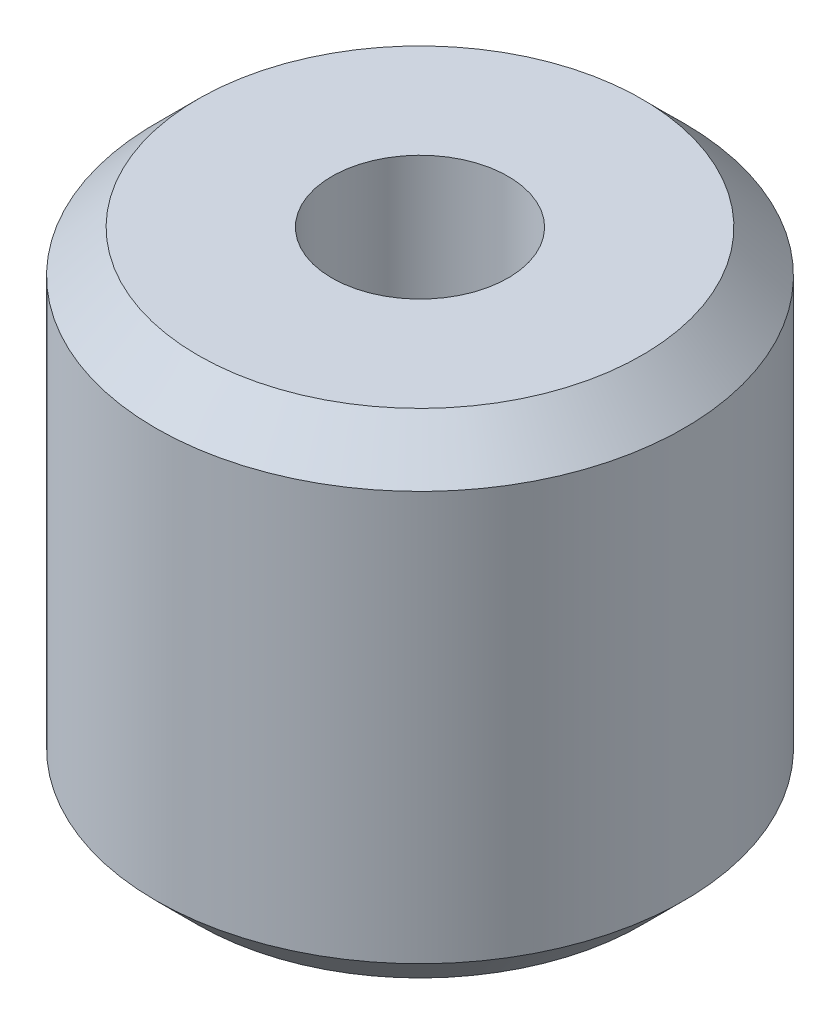
ISO-10303-21;
HEADER;
FILE_DESCRIPTION(('STEP AP214'),'2;1');
FILE_NAME('part.step','',(''),(''),'','','');
FILE_SCHEMA(('AUTOMOTIVE_DESIGN { 1 0 10303 214 1 1 1 1 }'));
ENDSEC;
DATA;
#1=APPLICATION_CONTEXT('core data for automotive mechanical design processes');
#2=APPLICATION_PROTOCOL_DEFINITION('international standard','automotive_design',2000,#1);
#3=PRODUCT_CONTEXT('',#1,'mechanical');
#4=PRODUCT('Part','Part','',(#3));
#5=PRODUCT_RELATED_PRODUCT_CATEGORY('part','',(#4));
#6=PRODUCT_DEFINITION_FORMATION('','',#4);
#7=PRODUCT_DEFINITION_CONTEXT('part definition',#1,'design');
#8=PRODUCT_DEFINITION('design','',#6,#7);
#9=PRODUCT_DEFINITION_SHAPE('','',#8);
#10=(LENGTH_UNIT() NAMED_UNIT(*) SI_UNIT(.MILLI.,.METRE.));
#11=(NAMED_UNIT(*) PLANE_ANGLE_UNIT() SI_UNIT($,.RADIAN.));
#12=(NAMED_UNIT(*) SI_UNIT($,.STERADIAN.) SOLID_ANGLE_UNIT());
#13=UNCERTAINTY_MEASURE_WITH_UNIT(LENGTH_MEASURE(1.E-05),#10,'distance_accuracy_value','');
#14=(GEOMETRIC_REPRESENTATION_CONTEXT(3) GLOBAL_UNCERTAINTY_ASSIGNED_CONTEXT((#13)) GLOBAL_UNIT_ASSIGNED_CONTEXT((#10,
#11,#12)) REPRESENTATION_CONTEXT('',''));
#15=CARTESIAN_POINT('',(0.,0.,0.));
#16=DIRECTION('',(0.,0.,1.));
#17=DIRECTION('',(1.,0.,0.));
#18=AXIS2_PLACEMENT_3D('',#15,#16,#17);
#19=CARTESIAN_POINT('',(0.,8.9,0.));
#20=DIRECTION('',(0.,1.,0.));
#21=DIRECTION('',(0.,0.,1.));
#22=AXIS2_PLACEMENT_3D('',#19,#20,#21);
#23=PLANE('',#22);
#24=CARTESIAN_POINT('',(0.,8.9,0.));
#25=DIRECTION('',(0.,1.,0.));
#26=DIRECTION('',(0.,0.,1.));
#27=AXIS2_PLACEMENT_3D('',#24,#25,#26);
#28=CIRCLE('',#27,4.005);
#29=CARTESIAN_POINT('',(0.,8.9,4.005));
#30=VERTEX_POINT('',#29);
#31=EDGE_CURVE('E58',#30,#30,#28,.T.);
#32=ORIENTED_EDGE('',*,*,#31,.T.);
#33=EDGE_LOOP('',(#32));
#34=FACE_BOUND('',#33,.T.);
#35=CARTESIAN_POINT('',(0.,8.9,0.));
#36=DIRECTION('',(0.,1.,0.));
#37=DIRECTION('',(0.,0.,1.));
#38=AXIS2_PLACEMENT_3D('',#35,#36,#37);
#39=CIRCLE('',#38,1.59);
#40=CARTESIAN_POINT('',(0.,8.9,1.59));
#41=VERTEX_POINT('',#40);
#42=EDGE_CURVE('E64',#41,#41,#39,.T.);
#43=ORIENTED_EDGE('',*,*,#42,.F.);
#44=EDGE_LOOP('',(#43));
#45=FACE_BOUND('',#44,.T.);
#46=ADVANCED_FACE('F39',(#34,#45),#23,.T.);
#47=CARTESIAN_POINT('',(0.,0.,0.));
#48=DIRECTION('',(0.,1.,0.));
#49=DIRECTION('',(0.,0.,1.));
#50=AXIS2_PLACEMENT_3D('',#47,#48,#49);
#51=PLANE('',#50);
#52=CARTESIAN_POINT('',(0.,0.,0.));
#53=DIRECTION('',(0.,1.,0.));
#54=DIRECTION('',(0.,0.,1.));
#55=AXIS2_PLACEMENT_3D('',#52,#53,#54);
#56=CIRCLE('',#55,4.005);
#57=CARTESIAN_POINT('',(0.,0.,4.005));
#58=VERTEX_POINT('',#57);
#59=EDGE_CURVE('E10',#58,#58,#56,.F.);
#60=ORIENTED_EDGE('',*,*,#59,.T.);
#61=EDGE_LOOP('',(#60));
#62=FACE_BOUND('',#61,.T.);
#63=CARTESIAN_POINT('',(0.,0.,0.));
#64=DIRECTION('',(0.,1.,0.));
#65=DIRECTION('',(0.,0.,1.));
#66=AXIS2_PLACEMENT_3D('',#63,#64,#65);
#67=CIRCLE('',#66,1.59);
#68=CARTESIAN_POINT('',(0.,0.,1.59));
#69=VERTEX_POINT('',#68);
#70=EDGE_CURVE('E65',#69,#69,#67,.T.);
#71=ORIENTED_EDGE('',*,*,#70,.T.);
#72=EDGE_LOOP('',(#71));
#73=FACE_BOUND('',#72,.T.);
#74=ADVANCED_FACE('F77',(#62,#73),#51,.F.);
#75=CARTESIAN_POINT('',(0.,8.9,0.));
#76=DIRECTION('',(0.,-1.,0.));
#77=DIRECTION('',(0.,0.,-1.));
#78=AXIS2_PLACEMENT_3D('',#75,#76,#77);
#79=CYLINDRICAL_SURFACE('',#78,4.765);
#80=CARTESIAN_POINT('',(0.,0.760000000000002,0.));
#81=DIRECTION('',(0.,1.,0.));
#82=DIRECTION('',(0.,0.,1.));
#83=AXIS2_PLACEMENT_3D('',#80,#81,#82);
#84=CIRCLE('',#83,4.765);
#85=CARTESIAN_POINT('',(0.,0.760000000000002,4.765));
#86=VERTEX_POINT('',#85);
#87=EDGE_CURVE('E48',#86,#86,#84,.T.);
#88=ORIENTED_EDGE('',*,*,#87,.T.);
#89=EDGE_LOOP('',(#88));
#90=FACE_BOUND('',#89,.T.);
#91=CARTESIAN_POINT('',(0.,8.14,0.));
#92=DIRECTION('',(0.,1.,0.));
#93=DIRECTION('',(0.,0.,1.));
#94=AXIS2_PLACEMENT_3D('',#91,#92,#93);
#95=CIRCLE('',#94,4.765);
#96=CARTESIAN_POINT('',(0.,8.14,4.765));
#97=VERTEX_POINT('',#96);
#98=EDGE_CURVE('E53',#97,#97,#95,.F.);
#99=ORIENTED_EDGE('',*,*,#98,.T.);
#100=EDGE_LOOP('',(#99));
#101=FACE_BOUND('',#100,.T.);
#102=ADVANCED_FACE('F83',(#90,#101),#79,.T.);
#103=CARTESIAN_POINT('',(0.,8.9,0.));
#104=DIRECTION('',(0.,-1.,0.));
#105=DIRECTION('',(0.,0.,-1.));
#106=AXIS2_PLACEMENT_3D('',#103,#104,#105);
#107=CYLINDRICAL_SURFACE('',#106,1.59);
#108=ORIENTED_EDGE('',*,*,#42,.T.);
#109=EDGE_LOOP('',(#108));
#110=FACE_BOUND('',#109,.T.);
#111=ORIENTED_EDGE('',*,*,#70,.F.);
#112=EDGE_LOOP('',(#111));
#113=FACE_BOUND('',#112,.T.);
#114=ADVANCED_FACE('F73',(#110,#113),#107,.F.);
#115=CARTESIAN_POINT('',(0.,8.9,0.));
#116=DIRECTION('',(0.,-1.,0.));
#117=DIRECTION('',(0.,0.,-1.));
#118=AXIS2_PLACEMENT_3D('',#115,#116,#117);
#119=CONICAL_SURFACE('',#118,4.005,0.785398163397447);
#120=ORIENTED_EDGE('',*,*,#98,.F.);
#121=EDGE_LOOP('',(#120));
#122=FACE_BOUND('',#121,.T.);
#123=ORIENTED_EDGE('',*,*,#31,.F.);
#124=EDGE_LOOP('',(#123));
#125=FACE_BOUND('',#124,.T.);
#126=ADVANCED_FACE('F89',(#122,#125),#119,.T.);
#127=CARTESIAN_POINT('',(0.,0.760000000000002,0.));
#128=DIRECTION('',(0.,1.,0.));
#129=DIRECTION('',(0.,0.,1.));
#130=AXIS2_PLACEMENT_3D('',#127,#128,#129);
#131=CONICAL_SURFACE('',#130,4.765,0.78539816339745);
#132=CARTESIAN_POINT('',(0.,0.,4.005));
#133=CARTESIAN_POINT('',(0.,0.00791666666666678,4.01291666666666));
#134=CARTESIAN_POINT('',(0.,0.0158333333333334,4.02083333333333));
#135=CARTESIAN_POINT('',(0.,0.0316666666666667,4.03666666666666));
#136=CARTESIAN_POINT('',(0.,0.0395833333333333,4.04458333333333));
#137=CARTESIAN_POINT('',(0.,0.0554166666666667,4.06041666666666));
#138=CARTESIAN_POINT('',(0.,0.0633333333333334,4.06833333333333));
#139=CARTESIAN_POINT('',(0.,0.0791666666666668,4.08416666666666));
#140=CARTESIAN_POINT('',(0.,0.0870833333333334,4.09208333333333));
#141=CARTESIAN_POINT('',(0.,0.102916666666667,4.10791666666666));
#142=CARTESIAN_POINT('',(0.,0.110833333333334,4.11583333333333));
#143=CARTESIAN_POINT('',(0.,0.126666666666667,4.13166666666666));
#144=CARTESIAN_POINT('',(0.,0.134583333333334,4.13958333333333));
#145=CARTESIAN_POINT('',(0.,0.150416666666667,4.15541666666666));
#146=CARTESIAN_POINT('',(0.,0.158333333333334,4.16333333333333));
#147=CARTESIAN_POINT('',(0.,0.174166666666667,4.17916666666666));
#148=CARTESIAN_POINT('',(0.,0.182083333333334,4.18708333333333));
#149=CARTESIAN_POINT('',(0.,0.197916666666667,4.20291666666666));
#150=CARTESIAN_POINT('',(0.,0.205833333333334,4.21083333333333));
#151=CARTESIAN_POINT('',(0.,0.221666666666667,4.22666666666666));
#152=CARTESIAN_POINT('',(0.,0.229583333333334,4.23458333333333));
#153=CARTESIAN_POINT('',(0.,0.245416666666667,4.25041666666666));
#154=CARTESIAN_POINT('',(0.,0.253333333333334,4.25833333333333));
#155=CARTESIAN_POINT('',(0.,0.269166666666667,4.27416666666666));
#156=CARTESIAN_POINT('',(0.,0.277083333333334,4.28208333333333));
#157=CARTESIAN_POINT('',(0.,0.292916666666667,4.29791666666666));
#158=CARTESIAN_POINT('',(0.,0.300833333333334,4.30583333333333));
#159=CARTESIAN_POINT('',(0.,0.316666666666667,4.32166666666666));
#160=CARTESIAN_POINT('',(0.,0.324583333333334,4.32958333333333));
#161=CARTESIAN_POINT('',(0.,0.340416666666667,4.34541666666666));
#162=CARTESIAN_POINT('',(0.,0.348333333333334,4.35333333333333));
#163=CARTESIAN_POINT('',(0.,0.364166666666668,4.36916666666666));
#164=CARTESIAN_POINT('',(0.,0.372083333333334,4.37708333333333));
#165=CARTESIAN_POINT('',(0.,0.387916666666668,4.39291666666666));
#166=CARTESIAN_POINT('',(0.,0.395833333333334,4.40083333333333));
#167=CARTESIAN_POINT('',(0.,0.411666666666668,4.41666666666666));
#168=CARTESIAN_POINT('',(0.,0.419583333333334,4.42458333333333));
#169=CARTESIAN_POINT('',(0.,0.435416666666668,4.44041666666666));
#170=CARTESIAN_POINT('',(0.,0.443333333333334,4.44833333333333));
#171=CARTESIAN_POINT('',(0.,0.459166666666668,4.46416666666666));
#172=CARTESIAN_POINT('',(0.,0.467083333333334,4.47208333333333));
#173=CARTESIAN_POINT('',(0.,0.482916666666668,4.48791666666666));
#174=CARTESIAN_POINT('',(0.,0.490833333333335,4.49583333333333));
#175=CARTESIAN_POINT('',(0.,0.506666666666668,4.51166666666666));
#176=CARTESIAN_POINT('',(0.,0.514583333333335,4.51958333333333));
#177=CARTESIAN_POINT('',(0.,0.530416666666668,4.53541666666666));
#178=CARTESIAN_POINT('',(0.,0.538333333333335,4.54333333333333));
#179=CARTESIAN_POINT('',(0.,0.554166666666668,4.55916666666666));
#180=CARTESIAN_POINT('',(0.,0.562083333333335,4.56708333333333));
#181=CARTESIAN_POINT('',(0.,0.577916666666668,4.58291666666666));
#182=CARTESIAN_POINT('',(0.,0.585833333333335,4.59083333333333));
#183=CARTESIAN_POINT('',(0.,0.601666666666668,4.60666666666667));
#184=CARTESIAN_POINT('',(0.,0.609583333333335,4.61458333333333));
#185=CARTESIAN_POINT('',(0.,0.625416666666668,4.63041666666666));
#186=CARTESIAN_POINT('',(0.,0.633333333333335,4.63833333333333));
#187=CARTESIAN_POINT('',(0.,0.649166666666668,4.65416666666667));
#188=CARTESIAN_POINT('',(0.,0.657083333333335,4.66208333333333));
#189=CARTESIAN_POINT('',(0.,0.672916666666668,4.67791666666667));
#190=CARTESIAN_POINT('',(0.,0.680833333333335,4.68583333333333));
#191=CARTESIAN_POINT('',(0.,0.696666666666668,4.70166666666667));
#192=CARTESIAN_POINT('',(0.,0.704583333333335,4.70958333333333));
#193=CARTESIAN_POINT('',(0.,0.720416666666669,4.72541666666667));
#194=CARTESIAN_POINT('',(0.,0.728333333333335,4.73333333333333));
#195=CARTESIAN_POINT('',(0.,0.744166666666668,4.74916666666667));
#196=CARTESIAN_POINT('',(0.,0.752083333333335,4.75708333333333));
#197=CARTESIAN_POINT('',(0.,0.760000000000002,4.765));
#198=B_SPLINE_CURVE_WITH_KNOTS('',3,(#132,#133,#134,#135,#136,#137,#138,#139,#140,#141,#142,
#143,#144,#145,#146,#147,#148,#149,#150,#151,#152,#153,#154,#155,#156,#157,#158,#159,#160,#161,
#162,#163,#164,#165,#166,#167,#168,#169,#170,#171,#172,#173,#174,#175,#176,#177,#178,#179,#180,
#181,#182,#183,#184,#185,#186,#187,#188,#189,#190,#191,#192,#193,#194,#195,#196,#197),
.UNSPECIFIED.,.F.,.F.,(4,2,2,2,2,2,2,2,2,2,2,2,2,2,2,2,2,2,2,2,2,2,2,2,2,2,2,2,2,2,2,2,4),(0.,
0.0335875721063607,0.067175144212722,0.100762716319083,0.134350288425445,0.167937860531805,
0.201525432638166,0.235113004744528,0.268700576850889,0.30228814895725,0.335875721063611,
0.369463293169972,0.403050865276334,0.436638437382694,0.470226009489056,0.503813581595417,
0.537401153701778,0.570988725808139,0.6045762979145,0.638163870020861,0.671751442127223,
0.705339014233583,0.738926586339944,0.772514158446306,0.806101730552667,0.839689302659028,
0.873276874765389,0.90686444687175,0.940452018978112,0.974039591084473,1.00762716319083,
1.04121473529719,1.07480230740356),.UNSPECIFIED.);
#199=EDGE_CURVE('BSEAM42',#58,#86,#198,.T.);
#200=ORIENTED_EDGE('',*,*,#59,.F.);
#201=ORIENTED_EDGE('',*,*,#87,.F.);
#202=ORIENTED_EDGE('',*,*,#199,.T.);
#203=ORIENTED_EDGE('',*,*,#199,.F.);
#204=EDGE_LOOP('',(#200,#202,#201,#203));
#205=FACE_BOUND('',#204,.T.);
#206=ADVANCED_FACE('F42',(#205),#131,.T.);
#207=CLOSED_SHELL('',(#46,#74,#102,#114,#126,#206));
#208=MANIFOLD_SOLID_BREP('B2',#207);
#209=ADVANCED_BREP_SHAPE_REPRESENTATION('',(#18,#208),#14);
#210=SHAPE_DEFINITION_REPRESENTATION(#9,#209);
ENDSEC;
END-ISO-10303-21;
